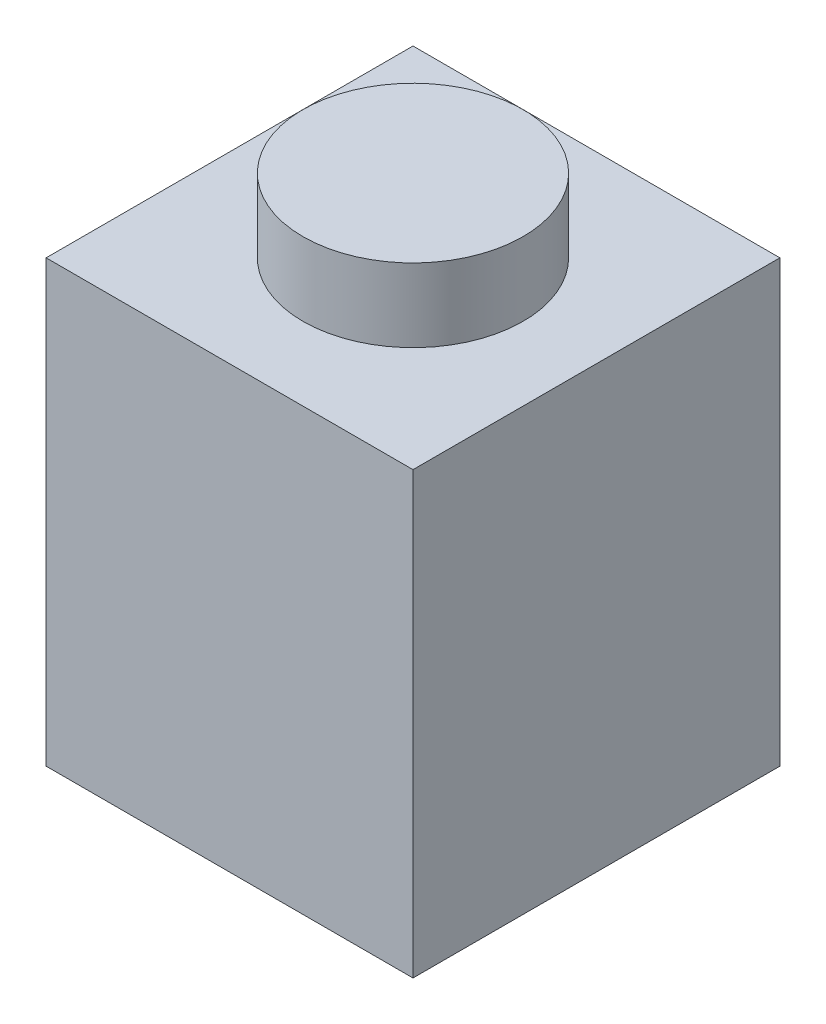
ISO-10303-21;
HEADER;
FILE_DESCRIPTION(('STEP AP214'),'2;1');
FILE_NAME('part.step','',(''),(''),'','','');
FILE_SCHEMA(('AUTOMOTIVE_DESIGN { 1 0 10303 214 1 1 1 1 }'));
ENDSEC;
DATA;
#1=APPLICATION_CONTEXT('core data for automotive mechanical design processes');
#2=APPLICATION_PROTOCOL_DEFINITION('international standard','automotive_design',2000,#1);
#3=PRODUCT_CONTEXT('',#1,'mechanical');
#4=PRODUCT('Part','Part','',(#3));
#5=PRODUCT_RELATED_PRODUCT_CATEGORY('part','',(#4));
#6=PRODUCT_DEFINITION_FORMATION('','',#4);
#7=PRODUCT_DEFINITION_CONTEXT('part definition',#1,'design');
#8=PRODUCT_DEFINITION('design','',#6,#7);
#9=PRODUCT_DEFINITION_SHAPE('','',#8);
#10=(LENGTH_UNIT() NAMED_UNIT(*) SI_UNIT(.MILLI.,.METRE.));
#11=(NAMED_UNIT(*) PLANE_ANGLE_UNIT() SI_UNIT($,.RADIAN.));
#12=(NAMED_UNIT(*) SI_UNIT($,.STERADIAN.) SOLID_ANGLE_UNIT());
#13=UNCERTAINTY_MEASURE_WITH_UNIT(LENGTH_MEASURE(1.E-05),#10,'distance_accuracy_value','');
#14=(GEOMETRIC_REPRESENTATION_CONTEXT(3) GLOBAL_UNCERTAINTY_ASSIGNED_CONTEXT((#13)) GLOBAL_UNIT_ASSIGNED_CONTEXT((#10,
#11,#12)) REPRESENTATION_CONTEXT('',''));
#15=CARTESIAN_POINT('',(0.,0.,0.));
#16=DIRECTION('',(0.,0.,1.));
#17=DIRECTION('',(1.,0.,0.));
#18=AXIS2_PLACEMENT_3D('',#15,#16,#17);
#19=CARTESIAN_POINT('',(0.,0.,0.));
#20=DIRECTION('',(0.,-1.,0.));
#21=DIRECTION('',(0.,0.,-1.));
#22=AXIS2_PLACEMENT_3D('',#19,#20,#21);
#23=PLANE('',#22);
#24=DIRECTION('',(0.,0.,1.));
#25=VECTOR('',#24,1.);
#26=CARTESIAN_POINT('',(0.,0.,0.));
#27=LINE('',#26,#25);
#28=CARTESIAN_POINT('',(0.,0.,-8.));
#29=VERTEX_POINT('',#28);
#30=CARTESIAN_POINT('',(0.,0.,0.));
#31=VERTEX_POINT('',#30);
#32=EDGE_CURVE('E159',#29,#31,#27,.T.);
#33=ORIENTED_EDGE('',*,*,#32,.F.);
#34=DIRECTION('',(-1.,0.,0.));
#35=VECTOR('',#34,1.);
#36=CARTESIAN_POINT('',(0.,0.,-8.));
#37=LINE('',#36,#35);
#38=CARTESIAN_POINT('',(8.,0.,-8.));
#39=VERTEX_POINT('',#38);
#40=EDGE_CURVE('E82',#39,#29,#37,.T.);
#41=ORIENTED_EDGE('',*,*,#40,.F.);
#42=DIRECTION('',(0.,0.,-1.));
#43=VECTOR('',#42,1.);
#44=CARTESIAN_POINT('',(8.,0.,0.));
#45=LINE('',#44,#43);
#46=CARTESIAN_POINT('',(8.,0.,0.));
#47=VERTEX_POINT('',#46);
#48=EDGE_CURVE('E172',#47,#39,#45,.T.);
#49=ORIENTED_EDGE('',*,*,#48,.F.);
#50=DIRECTION('',(1.,0.,0.));
#51=VECTOR('',#50,1.);
#52=CARTESIAN_POINT('',(0.,0.,0.));
#53=LINE('',#52,#51);
#54=EDGE_CURVE('E170',#31,#47,#53,.T.);
#55=ORIENTED_EDGE('',*,*,#54,.F.);
#56=EDGE_LOOP('',(#33,#41,#49,#55));
#57=FACE_BOUND('',#56,.T.);
#58=DIRECTION('',(-1.,0.,0.));
#59=VECTOR('',#58,1.);
#60=CARTESIAN_POINT('',(0.,0.,-6.4));
#61=LINE('',#60,#59);
#62=CARTESIAN_POINT('',(6.4,0.,-6.4));
#63=VERTEX_POINT('',#62);
#64=CARTESIAN_POINT('',(1.6,0.,-6.4));
#65=VERTEX_POINT('',#64);
#66=EDGE_CURVE('E130',#63,#65,#61,.T.);
#67=ORIENTED_EDGE('',*,*,#66,.T.);
#68=DIRECTION('',(0.,0.,1.));
#69=VECTOR('',#68,1.);
#70=CARTESIAN_POINT('',(1.6,0.,0.));
#71=LINE('',#70,#69);
#72=CARTESIAN_POINT('',(1.6,0.,-1.6));
#73=VERTEX_POINT('',#72);
#74=EDGE_CURVE('E152',#65,#73,#71,.T.);
#75=ORIENTED_EDGE('',*,*,#74,.T.);
#76=DIRECTION('',(1.,0.,0.));
#77=VECTOR('',#76,1.);
#78=CARTESIAN_POINT('',(0.,0.,-1.6));
#79=LINE('',#78,#77);
#80=CARTESIAN_POINT('',(6.4,0.,-1.6));
#81=VERTEX_POINT('',#80);
#82=EDGE_CURVE('E134',#73,#81,#79,.T.);
#83=ORIENTED_EDGE('',*,*,#82,.T.);
#84=DIRECTION('',(0.,0.,-1.));
#85=VECTOR('',#84,1.);
#86=CARTESIAN_POINT('',(6.4,0.,0.));
#87=LINE('',#86,#85);
#88=EDGE_CURVE('E52',#81,#63,#87,.T.);
#89=ORIENTED_EDGE('',*,*,#88,.T.);
#90=EDGE_LOOP('',(#67,#75,#83,#89));
#91=FACE_BOUND('',#90,.T.);
#92=ADVANCED_FACE('F36',(#57,#91),#23,.T.);
#93=CARTESIAN_POINT('',(0.,9.6,0.));
#94=DIRECTION('',(1.,0.,0.));
#95=DIRECTION('',(0.,0.,-1.));
#96=AXIS2_PLACEMENT_3D('',#93,#94,#95);
#97=PLANE('',#96);
#98=ORIENTED_EDGE('',*,*,#32,.T.);
#99=DIRECTION('',(0.,-1.,0.));
#100=VECTOR('',#99,1.);
#101=CARTESIAN_POINT('',(0.,9.6,0.));
#102=LINE('',#101,#100);
#103=CARTESIAN_POINT('',(0.,9.6,0.));
#104=VERTEX_POINT('',#103);
#105=EDGE_CURVE('E40',#104,#31,#102,.T.);
#106=ORIENTED_EDGE('',*,*,#105,.F.);
#107=DIRECTION('',(0.,0.,1.));
#108=VECTOR('',#107,1.);
#109=CARTESIAN_POINT('',(0.,9.6,0.));
#110=LINE('',#109,#108);
#111=CARTESIAN_POINT('',(0.,9.6,-8.));
#112=VERTEX_POINT('',#111);
#113=EDGE_CURVE('E161',#112,#104,#110,.T.);
#114=ORIENTED_EDGE('',*,*,#113,.F.);
#115=DIRECTION('',(0.,-1.,0.));
#116=VECTOR('',#115,1.);
#117=CARTESIAN_POINT('',(0.,9.6,-8.));
#118=LINE('',#117,#116);
#119=EDGE_CURVE('E167',#112,#29,#118,.T.);
#120=ORIENTED_EDGE('',*,*,#119,.T.);
#121=EDGE_LOOP('',(#98,#106,#114,#120));
#122=FACE_BOUND('',#121,.T.);
#123=ADVANCED_FACE('F38',(#122),#97,.F.);
#124=CARTESIAN_POINT('',(0.,9.6,0.));
#125=DIRECTION('',(0.,0.,-1.));
#126=DIRECTION('',(-1.,0.,0.));
#127=AXIS2_PLACEMENT_3D('',#124,#125,#126);
#128=PLANE('',#127);
#129=ORIENTED_EDGE('',*,*,#54,.T.);
#130=DIRECTION('',(0.,-1.,0.));
#131=VECTOR('',#130,1.);
#132=CARTESIAN_POINT('',(8.,9.6,0.));
#133=LINE('',#132,#131);
#134=CARTESIAN_POINT('',(8.,9.6,0.));
#135=VERTEX_POINT('',#134);
#136=EDGE_CURVE('E177',#135,#47,#133,.T.);
#137=ORIENTED_EDGE('',*,*,#136,.F.);
#138=DIRECTION('',(1.,0.,0.));
#139=VECTOR('',#138,1.);
#140=CARTESIAN_POINT('',(0.,9.6,0.));
#141=LINE('',#140,#139);
#142=EDGE_CURVE('E90',#104,#135,#141,.T.);
#143=ORIENTED_EDGE('',*,*,#142,.F.);
#144=ORIENTED_EDGE('',*,*,#105,.T.);
#145=EDGE_LOOP('',(#129,#137,#143,#144));
#146=FACE_BOUND('',#145,.T.);
#147=ADVANCED_FACE('F183',(#146),#128,.F.);
#148=CARTESIAN_POINT('',(8.,9.6,0.));
#149=DIRECTION('',(-1.,0.,0.));
#150=DIRECTION('',(0.,0.,1.));
#151=AXIS2_PLACEMENT_3D('',#148,#149,#150);
#152=PLANE('',#151);
#153=ORIENTED_EDGE('',*,*,#48,.T.);
#154=DIRECTION('',(0.,-1.,0.));
#155=VECTOR('',#154,1.);
#156=CARTESIAN_POINT('',(8.,9.6,-8.));
#157=LINE('',#156,#155);
#158=CARTESIAN_POINT('',(8.,9.6,-8.));
#159=VERTEX_POINT('',#158);
#160=EDGE_CURVE('E176',#159,#39,#157,.T.);
#161=ORIENTED_EDGE('',*,*,#160,.F.);
#162=DIRECTION('',(0.,0.,-1.));
#163=VECTOR('',#162,1.);
#164=CARTESIAN_POINT('',(8.,9.6,0.));
#165=LINE('',#164,#163);
#166=EDGE_CURVE('E164',#135,#159,#165,.T.);
#167=ORIENTED_EDGE('',*,*,#166,.F.);
#168=ORIENTED_EDGE('',*,*,#136,.T.);
#169=EDGE_LOOP('',(#153,#161,#167,#168));
#170=FACE_BOUND('',#169,.T.);
#171=ADVANCED_FACE('F190',(#170),#152,.F.);
#172=CARTESIAN_POINT('',(0.,9.6,-8.));
#173=DIRECTION('',(0.,0.,1.));
#174=DIRECTION('',(1.,0.,0.));
#175=AXIS2_PLACEMENT_3D('',#172,#173,#174);
#176=PLANE('',#175);
#177=ORIENTED_EDGE('',*,*,#40,.T.);
#178=ORIENTED_EDGE('',*,*,#119,.F.);
#179=DIRECTION('',(-1.,0.,0.));
#180=VECTOR('',#179,1.);
#181=CARTESIAN_POINT('',(0.,9.6,-8.));
#182=LINE('',#181,#180);
#183=EDGE_CURVE('E61',#159,#112,#182,.T.);
#184=ORIENTED_EDGE('',*,*,#183,.F.);
#185=ORIENTED_EDGE('',*,*,#160,.T.);
#186=EDGE_LOOP('',(#177,#178,#184,#185));
#187=FACE_BOUND('',#186,.T.);
#188=ADVANCED_FACE('F191',(#187),#176,.F.);
#189=CARTESIAN_POINT('',(0.,9.6,0.));
#190=DIRECTION('',(0.,-1.,0.));
#191=DIRECTION('',(0.,0.,-1.));
#192=AXIS2_PLACEMENT_3D('',#189,#190,#191);
#193=PLANE('',#192);
#194=CARTESIAN_POINT('',(4.,9.6,-4.));
#195=DIRECTION('',(0.,1.,0.));
#196=DIRECTION('',(0.,0.,1.));
#197=AXIS2_PLACEMENT_3D('',#194,#195,#196);
#198=CIRCLE('',#197,2.4);
#199=CARTESIAN_POINT('',(4.,9.6,-1.6));
#200=VERTEX_POINT('',#199);
#201=EDGE_CURVE('E11',#200,#200,#198,.T.);
#202=ORIENTED_EDGE('',*,*,#201,.F.);
#203=EDGE_LOOP('',(#202));
#204=FACE_BOUND('',#203,.T.);
#205=ORIENTED_EDGE('',*,*,#113,.T.);
#206=ORIENTED_EDGE('',*,*,#142,.T.);
#207=ORIENTED_EDGE('',*,*,#166,.T.);
#208=ORIENTED_EDGE('',*,*,#183,.T.);
#209=EDGE_LOOP('',(#205,#206,#207,#208));
#210=FACE_BOUND('',#209,.T.);
#211=ADVANCED_FACE('F192',(#204,#210),#193,.F.);
#212=CARTESIAN_POINT('',(4.,11.2,-4.));
#213=DIRECTION('',(0.,-1.,0.));
#214=DIRECTION('',(0.,0.,-1.));
#215=AXIS2_PLACEMENT_3D('',#212,#213,#214);
#216=CYLINDRICAL_SURFACE('',#215,2.4);
#217=CARTESIAN_POINT('',(4.,11.2,-4.));
#218=DIRECTION('',(0.,1.,0.));
#219=DIRECTION('',(0.,0.,1.));
#220=AXIS2_PLACEMENT_3D('',#217,#218,#219);
#221=CIRCLE('',#220,2.4);
#222=CARTESIAN_POINT('',(4.,11.2,-1.6));
#223=VERTEX_POINT('',#222);
#224=EDGE_CURVE('E139',#223,#223,#221,.T.);
#225=ORIENTED_EDGE('',*,*,#224,.F.);
#226=EDGE_LOOP('',(#225));
#227=FACE_BOUND('',#226,.T.);
#228=ORIENTED_EDGE('',*,*,#201,.T.);
#229=EDGE_LOOP('',(#228));
#230=FACE_BOUND('',#229,.T.);
#231=ADVANCED_FACE('F194',(#227,#230),#216,.T.);
#232=CARTESIAN_POINT('',(4.,11.2,-4.));
#233=DIRECTION('',(0.,1.,0.));
#234=DIRECTION('',(0.,0.,1.));
#235=AXIS2_PLACEMENT_3D('',#232,#233,#234);
#236=PLANE('',#235);
#237=ORIENTED_EDGE('',*,*,#224,.T.);
#238=EDGE_LOOP('',(#237));
#239=FACE_BOUND('',#238,.T.);
#240=ADVANCED_FACE('F201',(#239),#236,.T.);
#241=CARTESIAN_POINT('',(1.6,9.6,0.));
#242=DIRECTION('',(1.,0.,0.));
#243=DIRECTION('',(0.,0.,-1.));
#244=AXIS2_PLACEMENT_3D('',#241,#242,#243);
#245=PLANE('',#244);
#246=ORIENTED_EDGE('',*,*,#74,.F.);
#247=DIRECTION('',(0.,-1.,0.));
#248=VECTOR('',#247,1.);
#249=CARTESIAN_POINT('',(1.6,9.6,-6.4));
#250=LINE('',#249,#248);
#251=CARTESIAN_POINT('',(1.6,8.,-6.4));
#252=VERTEX_POINT('',#251);
#253=EDGE_CURVE('E129',#252,#65,#250,.T.);
#254=ORIENTED_EDGE('',*,*,#253,.F.);
#255=DIRECTION('',(0.,0.,1.));
#256=VECTOR('',#255,1.);
#257=CARTESIAN_POINT('',(1.6,8.,0.));
#258=LINE('',#257,#256);
#259=CARTESIAN_POINT('',(1.6,8.,-1.6));
#260=VERTEX_POINT('',#259);
#261=EDGE_CURVE('E117',#252,#260,#258,.T.);
#262=ORIENTED_EDGE('',*,*,#261,.T.);
#263=DIRECTION('',(0.,-1.,0.));
#264=VECTOR('',#263,1.);
#265=CARTESIAN_POINT('',(1.6,9.6,-1.6));
#266=LINE('',#265,#264);
#267=EDGE_CURVE('E127',#260,#73,#266,.T.);
#268=ORIENTED_EDGE('',*,*,#267,.T.);
#269=EDGE_LOOP('',(#246,#254,#262,#268));
#270=FACE_BOUND('',#269,.T.);
#271=ADVANCED_FACE('F126',(#270),#245,.T.);
#272=CARTESIAN_POINT('',(0.,9.6,-1.6));
#273=DIRECTION('',(0.,0.,-1.));
#274=DIRECTION('',(-1.,0.,0.));
#275=AXIS2_PLACEMENT_3D('',#272,#273,#274);
#276=PLANE('',#275);
#277=ORIENTED_EDGE('',*,*,#82,.F.);
#278=ORIENTED_EDGE('',*,*,#267,.F.);
#279=DIRECTION('',(1.,0.,0.));
#280=VECTOR('',#279,1.);
#281=CARTESIAN_POINT('',(0.,8.,-1.6));
#282=LINE('',#281,#280);
#283=CARTESIAN_POINT('',(6.4,8.,-1.6));
#284=VERTEX_POINT('',#283);
#285=EDGE_CURVE('E113',#260,#284,#282,.T.);
#286=ORIENTED_EDGE('',*,*,#285,.T.);
#287=DIRECTION('',(0.,-1.,0.));
#288=VECTOR('',#287,1.);
#289=CARTESIAN_POINT('',(6.4,9.6,-1.6));
#290=LINE('',#289,#288);
#291=EDGE_CURVE('E136',#284,#81,#290,.T.);
#292=ORIENTED_EDGE('',*,*,#291,.T.);
#293=EDGE_LOOP('',(#277,#278,#286,#292));
#294=FACE_BOUND('',#293,.T.);
#295=ADVANCED_FACE('F132',(#294),#276,.T.);
#296=CARTESIAN_POINT('',(6.4,9.6,0.));
#297=DIRECTION('',(-1.,0.,0.));
#298=DIRECTION('',(0.,0.,1.));
#299=AXIS2_PLACEMENT_3D('',#296,#297,#298);
#300=PLANE('',#299);
#301=ORIENTED_EDGE('',*,*,#88,.F.);
#302=ORIENTED_EDGE('',*,*,#291,.F.);
#303=DIRECTION('',(0.,0.,-1.));
#304=VECTOR('',#303,1.);
#305=CARTESIAN_POINT('',(6.4,8.,0.));
#306=LINE('',#305,#304);
#307=CARTESIAN_POINT('',(6.4,8.,-6.4));
#308=VERTEX_POINT('',#307);
#309=EDGE_CURVE('E118',#284,#308,#306,.T.);
#310=ORIENTED_EDGE('',*,*,#309,.T.);
#311=DIRECTION('',(0.,-1.,0.));
#312=VECTOR('',#311,1.);
#313=CARTESIAN_POINT('',(6.4,9.6,-6.4));
#314=LINE('',#313,#312);
#315=EDGE_CURVE('E141',#308,#63,#314,.T.);
#316=ORIENTED_EDGE('',*,*,#315,.T.);
#317=EDGE_LOOP('',(#301,#302,#310,#316));
#318=FACE_BOUND('',#317,.T.);
#319=ADVANCED_FACE('F266',(#318),#300,.T.);
#320=CARTESIAN_POINT('',(0.,9.6,-6.4));
#321=DIRECTION('',(0.,0.,1.));
#322=DIRECTION('',(1.,0.,0.));
#323=AXIS2_PLACEMENT_3D('',#320,#321,#322);
#324=PLANE('',#323);
#325=ORIENTED_EDGE('',*,*,#66,.F.);
#326=ORIENTED_EDGE('',*,*,#315,.F.);
#327=DIRECTION('',(-1.,0.,0.));
#328=VECTOR('',#327,1.);
#329=CARTESIAN_POINT('',(0.,8.,-6.4));
#330=LINE('',#329,#328);
#331=EDGE_CURVE('E144',#308,#252,#330,.T.);
#332=ORIENTED_EDGE('',*,*,#331,.T.);
#333=ORIENTED_EDGE('',*,*,#253,.T.);
#334=EDGE_LOOP('',(#325,#326,#332,#333));
#335=FACE_BOUND('',#334,.T.);
#336=ADVANCED_FACE('F275',(#335),#324,.T.);
#337=CARTESIAN_POINT('',(0.,8.,0.));
#338=DIRECTION('',(0.,-1.,0.));
#339=DIRECTION('',(0.,0.,-1.));
#340=AXIS2_PLACEMENT_3D('',#337,#338,#339);
#341=PLANE('',#340);
#342=CARTESIAN_POINT('',(4.,8.,-4.));
#343=DIRECTION('',(0.,-1.,0.));
#344=DIRECTION('',(0.,0.,-1.));
#345=AXIS2_PLACEMENT_3D('',#342,#343,#344);
#346=CIRCLE('',#345,0.799999999999999);
#347=CARTESIAN_POINT('',(4.,8.,-4.8));
#348=VERTEX_POINT('',#347);
#349=EDGE_CURVE('E135',#348,#348,#346,.F.);
#350=ORIENTED_EDGE('',*,*,#349,.T.);
#351=EDGE_LOOP('',(#350));
#352=FACE_BOUND('',#351,.T.);
#353=ORIENTED_EDGE('',*,*,#261,.F.);
#354=ORIENTED_EDGE('',*,*,#331,.F.);
#355=ORIENTED_EDGE('',*,*,#309,.F.);
#356=ORIENTED_EDGE('',*,*,#285,.F.);
#357=EDGE_LOOP('',(#353,#354,#355,#356));
#358=FACE_BOUND('',#357,.T.);
#359=ADVANCED_FACE('F115',(#352,#358),#341,.T.);
#360=CARTESIAN_POINT('',(4.,11.2,-4.));
#361=DIRECTION('',(0.,-1.,0.));
#362=DIRECTION('',(0.,0.,-1.));
#363=AXIS2_PLACEMENT_3D('',#360,#361,#362);
#364=CYLINDRICAL_SURFACE('',#363,0.799999999999999);
#365=CARTESIAN_POINT('',(4.,9.6,-4.));
#366=DIRECTION('',(0.,1.,0.));
#367=DIRECTION('',(0.,0.,1.));
#368=AXIS2_PLACEMENT_3D('',#365,#366,#367);
#369=CIRCLE('',#368,0.799999999999999);
#370=CARTESIAN_POINT('',(4.,9.6,-3.2));
#371=VERTEX_POINT('',#370);
#372=EDGE_CURVE('E149',#371,#371,#369,.T.);
#373=ORIENTED_EDGE('',*,*,#372,.T.);
#374=EDGE_LOOP('',(#373));
#375=FACE_BOUND('',#374,.T.);
#376=ORIENTED_EDGE('',*,*,#349,.F.);
#377=EDGE_LOOP('',(#376));
#378=FACE_BOUND('',#377,.T.);
#379=ADVANCED_FACE('F293',(#375,#378),#364,.F.);
#380=CARTESIAN_POINT('',(4.,9.6,-4.));
#381=DIRECTION('',(0.,1.,0.));
#382=DIRECTION('',(0.,0.,1.));
#383=AXIS2_PLACEMENT_3D('',#380,#381,#382);
#384=PLANE('',#383);
#385=ORIENTED_EDGE('',*,*,#372,.F.);
#386=EDGE_LOOP('',(#385));
#387=FACE_BOUND('',#386,.T.);
#388=ADVANCED_FACE('F303',(#387),#384,.F.);
#389=CLOSED_SHELL('',(#92,#123,#147,#171,#188,#211,#231,#240,#271,#295,#319,#336,#359,#379,#388));
#390=MANIFOLD_SOLID_BREP('B2',#389);
#391=ADVANCED_BREP_SHAPE_REPRESENTATION('',(#18,#390),#14);
#392=SHAPE_DEFINITION_REPRESENTATION(#9,#391);
ENDSEC;
END-ISO-10303-21;
